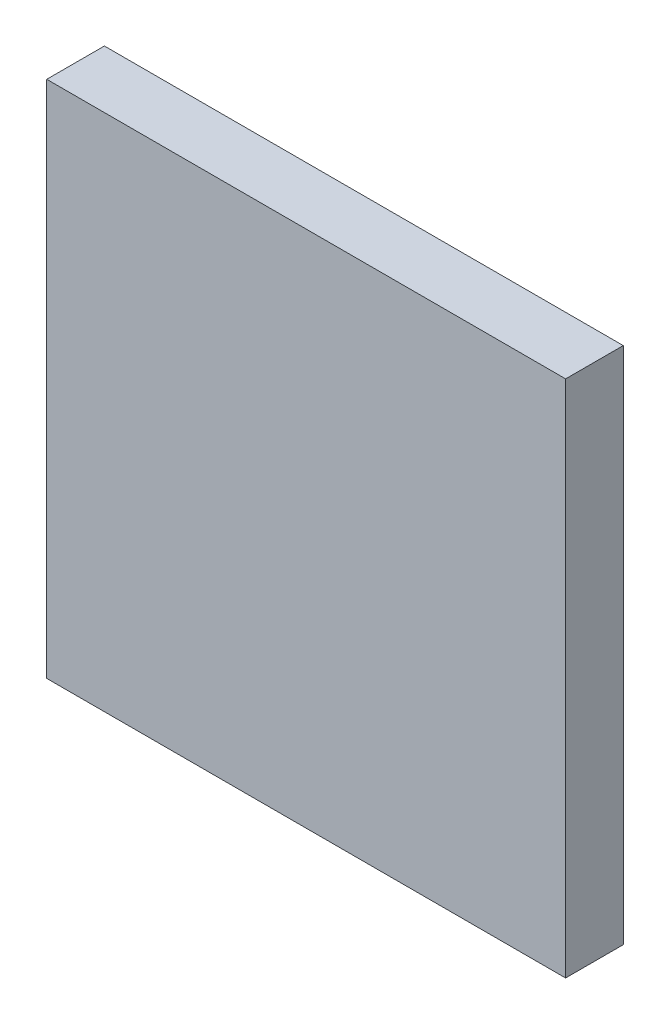
ISO-10303-21;
HEADER;
FILE_DESCRIPTION(('STEP AP214'),'2;1');
FILE_NAME('part.step','',(''),(''),'','','');
FILE_SCHEMA(('AUTOMOTIVE_DESIGN { 1 0 10303 214 1 1 1 1 }'));
ENDSEC;
DATA;
#1=APPLICATION_CONTEXT('core data for automotive mechanical design processes');
#2=APPLICATION_PROTOCOL_DEFINITION('international standard','automotive_design',2000,#1);
#3=PRODUCT_CONTEXT('',#1,'mechanical');
#4=PRODUCT('Part','Part','',(#3));
#5=PRODUCT_RELATED_PRODUCT_CATEGORY('part','',(#4));
#6=PRODUCT_DEFINITION_FORMATION('','',#4);
#7=PRODUCT_DEFINITION_CONTEXT('part definition',#1,'design');
#8=PRODUCT_DEFINITION('design','',#6,#7);
#9=PRODUCT_DEFINITION_SHAPE('','',#8);
#10=(LENGTH_UNIT() NAMED_UNIT(*) SI_UNIT(.MILLI.,.METRE.));
#11=(NAMED_UNIT(*) PLANE_ANGLE_UNIT() SI_UNIT($,.RADIAN.));
#12=(NAMED_UNIT(*) SI_UNIT($,.STERADIAN.) SOLID_ANGLE_UNIT());
#13=UNCERTAINTY_MEASURE_WITH_UNIT(LENGTH_MEASURE(1.E-05),#10,'distance_accuracy_value','');
#14=(GEOMETRIC_REPRESENTATION_CONTEXT(3) GLOBAL_UNCERTAINTY_ASSIGNED_CONTEXT((#13)) GLOBAL_UNIT_ASSIGNED_CONTEXT((#10,
#11,#12)) REPRESENTATION_CONTEXT('',''));
#15=CARTESIAN_POINT('',(0.,0.,0.));
#16=DIRECTION('',(0.,0.,1.));
#17=DIRECTION('',(1.,0.,0.));
#18=AXIS2_PLACEMENT_3D('',#15,#16,#17);
#19=CARTESIAN_POINT('',(13.510000201166,39.510000588596,-2.57));
#20=CARTESIAN_POINT('',(4.490000201166,39.510000588596,-2.57));
#21=CARTESIAN_POINT('',(13.510000201166,30.490000588596,-2.57));
#22=CARTESIAN_POINT('',(4.490000201166,30.490000588596,-2.57));
#23=(BOUNDED_SURFACE() B_SPLINE_SURFACE(1,1,((#19,#20),(#21,#22)),.UNSPECIFIED.,.F.,.F.,
.F.) B_SPLINE_SURFACE_WITH_KNOTS((2,2),(2,2),(-0.451,0.451),(-0.451,0.451),
.UNSPECIFIED.) GEOMETRIC_REPRESENTATION_ITEM() RATIONAL_B_SPLINE_SURFACE(((1.,1.),(1.,1.))) REPRESENTATION_ITEM('') SURFACE());
#24=CARTESIAN_POINT('',(13.500000201166,30.500000588596,-2.57));
#25=CARTESIAN_POINT('',(4.500000201166,30.500000588596,-2.57));
#26=(BOUNDED_CURVE() B_SPLINE_CURVE(1,(#24,#25),.UNSPECIFIED.,.F.,
.F.) B_SPLINE_CURVE_WITH_KNOTS((2,2),(-0.45,0.45),
.UNSPECIFIED.) CURVE() GEOMETRIC_REPRESENTATION_ITEM() RATIONAL_B_SPLINE_CURVE((1.,1.)) REPRESENTATION_ITEM(''));
#27=CARTESIAN_POINT('',(13.500000201166,30.500000588596,-2.57));
#28=VERTEX_POINT('',#27);
#29=CARTESIAN_POINT('',(4.500000201166,30.500000588596,-2.57));
#30=VERTEX_POINT('',#29);
#31=EDGE_CURVE('E91',#28,#30,#26,.T.);
#32=CARTESIAN_POINT('',(4.500000201166,30.500000588596,-2.57));
#33=CARTESIAN_POINT('',(4.500000201166,39.500000588596,-2.57));
#34=(BOUNDED_CURVE() B_SPLINE_CURVE(1,(#32,#33),.UNSPECIFIED.,.F.,
.F.) B_SPLINE_CURVE_WITH_KNOTS((2,2),(-0.45,0.45),
.UNSPECIFIED.) CURVE() GEOMETRIC_REPRESENTATION_ITEM() RATIONAL_B_SPLINE_CURVE((1.,1.)) REPRESENTATION_ITEM(''));
#35=CARTESIAN_POINT('',(4.500000201166,39.500000588596,-2.57));
#36=VERTEX_POINT('',#35);
#37=EDGE_CURVE('E123',#30,#36,#34,.T.);
#38=CARTESIAN_POINT('',(4.500000201166,39.500000588596,-2.57));
#39=CARTESIAN_POINT('',(13.500000201166,39.500000588596,-2.57));
#40=(BOUNDED_CURVE() B_SPLINE_CURVE(1,(#38,#39),.UNSPECIFIED.,.F.,
.F.) B_SPLINE_CURVE_WITH_KNOTS((2,2),(-0.45,0.45),
.UNSPECIFIED.) CURVE() GEOMETRIC_REPRESENTATION_ITEM() RATIONAL_B_SPLINE_CURVE((1.,1.)) REPRESENTATION_ITEM(''));
#41=CARTESIAN_POINT('',(13.500000201166,39.500000588596,-2.57));
#42=VERTEX_POINT('',#41);
#43=EDGE_CURVE('E77',#36,#42,#40,.T.);
#44=CARTESIAN_POINT('',(13.500000201166,39.500000588596,-2.57));
#45=CARTESIAN_POINT('',(13.500000201166,30.500000588596,-2.57));
#46=(BOUNDED_CURVE() B_SPLINE_CURVE(1,(#44,#45),.UNSPECIFIED.,.F.,
.F.) B_SPLINE_CURVE_WITH_KNOTS((2,2),(-0.45,0.45),
.UNSPECIFIED.) CURVE() GEOMETRIC_REPRESENTATION_ITEM() RATIONAL_B_SPLINE_CURVE((1.,1.)) REPRESENTATION_ITEM(''));
#47=EDGE_CURVE('E11',#42,#28,#46,.T.);
#48=ORIENTED_EDGE('',*,*,#31,.T.);
#49=ORIENTED_EDGE('',*,*,#37,.T.);
#50=ORIENTED_EDGE('',*,*,#43,.T.);
#51=ORIENTED_EDGE('',*,*,#47,.T.);
#52=EDGE_LOOP('',(#48,#49,#50,#51));
#53=FACE_BOUND('',#52,.T.);
#54=ADVANCED_FACE('F17',(#53),#23,.T.);
#55=CARTESIAN_POINT('',(13.510000201166,30.490000588596,-1.57));
#56=CARTESIAN_POINT('',(4.490000201166,30.490000588596,-1.57));
#57=CARTESIAN_POINT('',(13.510000201166,39.510000588596,-1.57));
#58=CARTESIAN_POINT('',(4.490000201166,39.510000588596,-1.57));
#59=(BOUNDED_SURFACE() B_SPLINE_SURFACE(1,1,((#55,#56),(#57,#58)),.UNSPECIFIED.,.F.,.F.,
.F.) B_SPLINE_SURFACE_WITH_KNOTS((2,2),(2,2),(-0.451,0.451),(-0.451,0.451),
.UNSPECIFIED.) GEOMETRIC_REPRESENTATION_ITEM() RATIONAL_B_SPLINE_SURFACE(((1.,1.),(1.,1.))) REPRESENTATION_ITEM('') SURFACE());
#60=CARTESIAN_POINT('',(4.500000201166,30.500000588596,-1.57));
#61=CARTESIAN_POINT('',(13.500000201166,30.500000588596,-1.57));
#62=(BOUNDED_CURVE() B_SPLINE_CURVE(1,(#60,#61),.UNSPECIFIED.,.F.,
.F.) B_SPLINE_CURVE_WITH_KNOTS((2,2),(-0.45,0.45),
.UNSPECIFIED.) CURVE() GEOMETRIC_REPRESENTATION_ITEM() RATIONAL_B_SPLINE_CURVE((1.,1.)) REPRESENTATION_ITEM(''));
#63=CARTESIAN_POINT('',(4.500000201166,30.500000588596,-1.57));
#64=VERTEX_POINT('',#63);
#65=CARTESIAN_POINT('',(13.500000201166,30.500000588596,-1.57));
#66=VERTEX_POINT('',#65);
#67=EDGE_CURVE('E79',#64,#66,#62,.T.);
#68=CARTESIAN_POINT('',(13.500000201166,30.500000588596,-1.57));
#69=CARTESIAN_POINT('',(13.500000201166,39.500000588596,-1.57));
#70=(BOUNDED_CURVE() B_SPLINE_CURVE(1,(#68,#69),.UNSPECIFIED.,.F.,
.F.) B_SPLINE_CURVE_WITH_KNOTS((2,2),(-0.45,0.45),
.UNSPECIFIED.) CURVE() GEOMETRIC_REPRESENTATION_ITEM() RATIONAL_B_SPLINE_CURVE((1.,1.)) REPRESENTATION_ITEM(''));
#71=CARTESIAN_POINT('',(13.500000201166,39.500000588596,-1.57));
#72=VERTEX_POINT('',#71);
#73=EDGE_CURVE('E31',#66,#72,#70,.T.);
#74=CARTESIAN_POINT('',(13.500000201166,39.500000588596,-1.57));
#75=CARTESIAN_POINT('',(4.500000201166,39.500000588596,-1.57));
#76=(BOUNDED_CURVE() B_SPLINE_CURVE(1,(#74,#75),.UNSPECIFIED.,.F.,
.F.) B_SPLINE_CURVE_WITH_KNOTS((2,2),(-0.45,0.45),
.UNSPECIFIED.) CURVE() GEOMETRIC_REPRESENTATION_ITEM() RATIONAL_B_SPLINE_CURVE((1.,1.)) REPRESENTATION_ITEM(''));
#77=CARTESIAN_POINT('',(4.500000201166,39.500000588596,-1.57));
#78=VERTEX_POINT('',#77);
#79=EDGE_CURVE('E115',#72,#78,#76,.T.);
#80=CARTESIAN_POINT('',(4.500000201166,39.500000588596,-1.57));
#81=CARTESIAN_POINT('',(4.500000201166,30.500000588596,-1.57));
#82=(BOUNDED_CURVE() B_SPLINE_CURVE(1,(#80,#81),.UNSPECIFIED.,.F.,
.F.) B_SPLINE_CURVE_WITH_KNOTS((2,2),(-0.45,0.45),
.UNSPECIFIED.) CURVE() GEOMETRIC_REPRESENTATION_ITEM() RATIONAL_B_SPLINE_CURVE((1.,1.)) REPRESENTATION_ITEM(''));
#83=EDGE_CURVE('E82',#78,#64,#82,.T.);
#84=ORIENTED_EDGE('',*,*,#67,.T.);
#85=ORIENTED_EDGE('',*,*,#73,.T.);
#86=ORIENTED_EDGE('',*,*,#79,.T.);
#87=ORIENTED_EDGE('',*,*,#83,.T.);
#88=EDGE_LOOP('',(#84,#85,#86,#87));
#89=FACE_BOUND('',#88,.T.);
#90=ADVANCED_FACE('F80',(#89),#59,.T.);
#91=CARTESIAN_POINT('',(13.500000201166,39.510000588596,-2.58));
#92=CARTESIAN_POINT('',(13.500000201166,30.490000588596,-2.58));
#93=CARTESIAN_POINT('',(13.500000201166,39.510000588596,-1.56));
#94=CARTESIAN_POINT('',(13.500000201166,30.490000588596,-1.56));
#95=(BOUNDED_SURFACE() B_SPLINE_SURFACE(1,1,((#91,#92),(#93,#94)),.UNSPECIFIED.,.F.,.F.,
.F.) B_SPLINE_SURFACE_WITH_KNOTS((2,2),(2,2),(-0.051,0.051),(-0.451,0.451),
.UNSPECIFIED.) GEOMETRIC_REPRESENTATION_ITEM() RATIONAL_B_SPLINE_SURFACE(((1.,1.),(1.,1.))) REPRESENTATION_ITEM('') SURFACE());
#96=CARTESIAN_POINT('',(13.500000201166,39.500000588596,-2.57));
#97=CARTESIAN_POINT('',(13.500000201166,39.500000588596,-1.57));
#98=(BOUNDED_CURVE() B_SPLINE_CURVE(1,(#96,#97),.UNSPECIFIED.,.F.,
.F.) B_SPLINE_CURVE_WITH_KNOTS((2,2),(-0.05,0.05),
.UNSPECIFIED.) CURVE() GEOMETRIC_REPRESENTATION_ITEM() RATIONAL_B_SPLINE_CURVE((1.,1.)) REPRESENTATION_ITEM(''));
#99=EDGE_CURVE('E72',#42,#72,#98,.T.);
#100=CARTESIAN_POINT('',(13.500000201166,30.500000588596,-2.57));
#101=CARTESIAN_POINT('',(13.500000201166,30.500000588596,-1.57));
#102=(BOUNDED_CURVE() B_SPLINE_CURVE(1,(#100,#101),.UNSPECIFIED.,.F.,
.F.) B_SPLINE_CURVE_WITH_KNOTS((2,2),(-0.05,0.05),
.UNSPECIFIED.) CURVE() GEOMETRIC_REPRESENTATION_ITEM() RATIONAL_B_SPLINE_CURVE((1.,1.)) REPRESENTATION_ITEM(''));
#103=EDGE_CURVE('E70',#28,#66,#102,.T.);
#104=ORIENTED_EDGE('',*,*,#99,.T.);
#105=ORIENTED_EDGE('',*,*,#73,.F.);
#106=ORIENTED_EDGE('',*,*,#103,.F.);
#107=ORIENTED_EDGE('',*,*,#47,.F.);
#108=EDGE_LOOP('',(#104,#105,#106,#107));
#109=FACE_BOUND('',#108,.T.);
#110=ADVANCED_FACE('F68',(#109),#95,.T.);
#111=CARTESIAN_POINT('',(13.510000201166,39.500000588596,-1.56));
#112=CARTESIAN_POINT('',(4.490000201166,39.500000588596,-1.56));
#113=CARTESIAN_POINT('',(13.510000201166,39.500000588596,-2.58));
#114=CARTESIAN_POINT('',(4.490000201166,39.500000588596,-2.58));
#115=(BOUNDED_SURFACE() B_SPLINE_SURFACE(1,1,((#111,#112),(#113,#114)),.UNSPECIFIED.,.F.,.F.,
.F.) B_SPLINE_SURFACE_WITH_KNOTS((2,2),(2,2),(-0.051,0.051),(-0.451,0.451),
.UNSPECIFIED.) GEOMETRIC_REPRESENTATION_ITEM() RATIONAL_B_SPLINE_SURFACE(((1.,1.),(1.,1.))) REPRESENTATION_ITEM('') SURFACE());
#116=CARTESIAN_POINT('',(4.500000201166,39.500000588596,-2.57));
#117=CARTESIAN_POINT('',(4.500000201166,39.500000588596,-1.57));
#118=(BOUNDED_CURVE() B_SPLINE_CURVE(1,(#116,#117),.UNSPECIFIED.,.F.,
.F.) B_SPLINE_CURVE_WITH_KNOTS((2,2),(-0.05,0.05),
.UNSPECIFIED.) CURVE() GEOMETRIC_REPRESENTATION_ITEM() RATIONAL_B_SPLINE_CURVE((1.,1.)) REPRESENTATION_ITEM(''));
#119=EDGE_CURVE('E131',#36,#78,#118,.T.);
#120=ORIENTED_EDGE('',*,*,#119,.T.);
#121=ORIENTED_EDGE('',*,*,#79,.F.);
#122=ORIENTED_EDGE('',*,*,#99,.F.);
#123=ORIENTED_EDGE('',*,*,#43,.F.);
#124=EDGE_LOOP('',(#120,#121,#122,#123));
#125=FACE_BOUND('',#124,.T.);
#126=ADVANCED_FACE('F175',(#125),#115,.T.);
#127=CARTESIAN_POINT('',(4.500000201166,39.510000588596,-1.56));
#128=CARTESIAN_POINT('',(4.500000201166,30.490000588596,-1.56));
#129=CARTESIAN_POINT('',(4.500000201166,39.510000588596,-2.58));
#130=CARTESIAN_POINT('',(4.500000201166,30.490000588596,-2.58));
#131=(BOUNDED_SURFACE() B_SPLINE_SURFACE(1,1,((#127,#128),(#129,#130)),.UNSPECIFIED.,.F.,.F.,
.F.) B_SPLINE_SURFACE_WITH_KNOTS((2,2),(2,2),(-0.051,0.051),(-0.451,0.451),
.UNSPECIFIED.) GEOMETRIC_REPRESENTATION_ITEM() RATIONAL_B_SPLINE_SURFACE(((1.,1.),(1.,1.))) REPRESENTATION_ITEM('') SURFACE());
#132=CARTESIAN_POINT('',(4.500000201166,30.500000588596,-2.57));
#133=CARTESIAN_POINT('',(4.500000201166,30.500000588596,-1.57));
#134=(BOUNDED_CURVE() B_SPLINE_CURVE(1,(#132,#133),.UNSPECIFIED.,.F.,
.F.) B_SPLINE_CURVE_WITH_KNOTS((2,2),(-0.05,0.05),
.UNSPECIFIED.) CURVE() GEOMETRIC_REPRESENTATION_ITEM() RATIONAL_B_SPLINE_CURVE((1.,1.)) REPRESENTATION_ITEM(''));
#135=EDGE_CURVE('E22',#30,#64,#134,.T.);
#136=ORIENTED_EDGE('',*,*,#135,.T.);
#137=ORIENTED_EDGE('',*,*,#83,.F.);
#138=ORIENTED_EDGE('',*,*,#119,.F.);
#139=ORIENTED_EDGE('',*,*,#37,.F.);
#140=EDGE_LOOP('',(#136,#137,#138,#139));
#141=FACE_BOUND('',#140,.T.);
#142=ADVANCED_FACE('F177',(#141),#131,.T.);
#143=CARTESIAN_POINT('',(13.510000201166,30.500000588596,-2.58));
#144=CARTESIAN_POINT('',(4.490000201166,30.500000588596,-2.58));
#145=CARTESIAN_POINT('',(13.510000201166,30.500000588596,-1.56));
#146=CARTESIAN_POINT('',(4.490000201166,30.500000588596,-1.56));
#147=(BOUNDED_SURFACE() B_SPLINE_SURFACE(1,1,((#143,#144),(#145,#146)),.UNSPECIFIED.,.F.,.F.,
.F.) B_SPLINE_SURFACE_WITH_KNOTS((2,2),(2,2),(-0.051,0.051),(-0.451,0.451),
.UNSPECIFIED.) GEOMETRIC_REPRESENTATION_ITEM() RATIONAL_B_SPLINE_SURFACE(((1.,1.),(1.,1.))) REPRESENTATION_ITEM('') SURFACE());
#148=ORIENTED_EDGE('',*,*,#103,.T.);
#149=ORIENTED_EDGE('',*,*,#67,.F.);
#150=ORIENTED_EDGE('',*,*,#135,.F.);
#151=ORIENTED_EDGE('',*,*,#31,.F.);
#152=EDGE_LOOP('',(#148,#149,#150,#151));
#153=FACE_BOUND('',#152,.T.);
#154=ADVANCED_FACE('F89',(#153),#147,.T.);
#155=CLOSED_SHELL('',(#54,#90,#110,#126,#142,#154));
#156=MANIFOLD_SOLID_BREP('B1',#155);
#157=ADVANCED_BREP_SHAPE_REPRESENTATION('',(#18,#156),#14);
#158=SHAPE_DEFINITION_REPRESENTATION(#9,#157);
ENDSEC;
END-ISO-10303-21;
